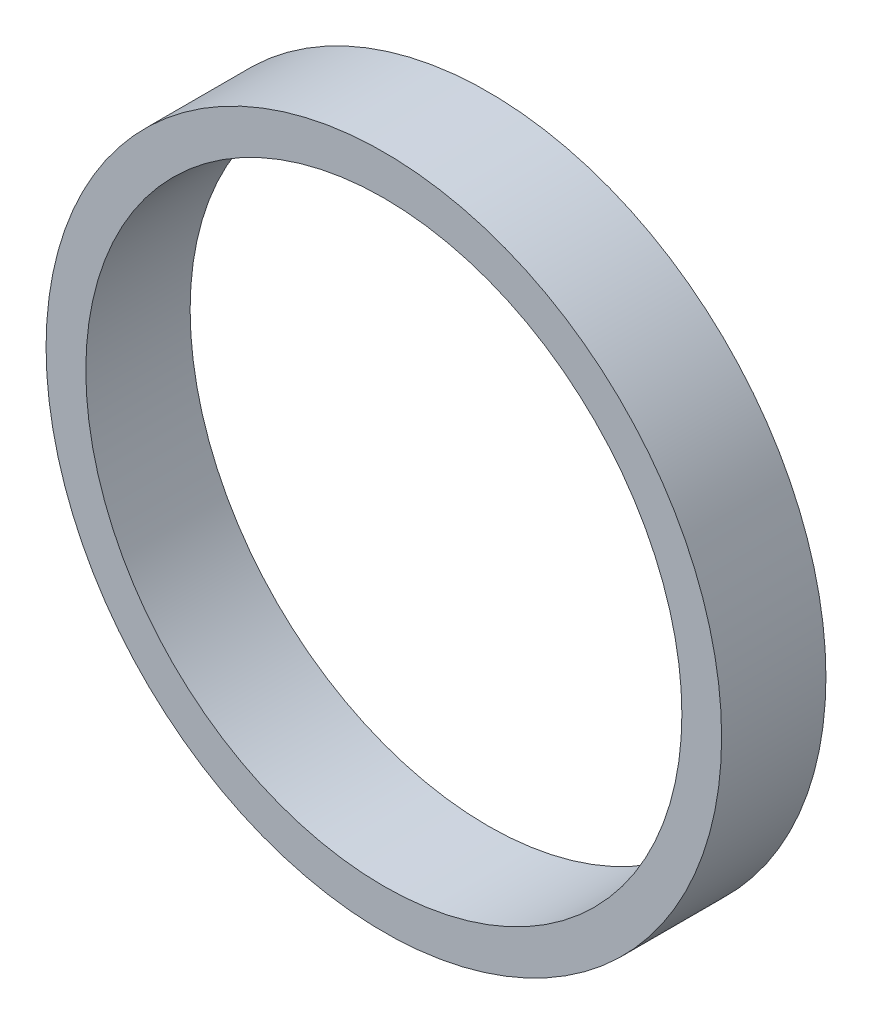
ISO-10303-21;
HEADER;
FILE_DESCRIPTION(('STEP AP214'),'2;1');
FILE_NAME('part.step','',(''),(''),'','','');
FILE_SCHEMA(('AUTOMOTIVE_DESIGN { 1 0 10303 214 1 1 1 1 }'));
ENDSEC;
DATA;
#1=APPLICATION_CONTEXT('core data for automotive mechanical design processes');
#2=APPLICATION_PROTOCOL_DEFINITION('international standard','automotive_design',2000,#1);
#3=PRODUCT_CONTEXT('',#1,'mechanical');
#4=PRODUCT('Part','Part','',(#3));
#5=PRODUCT_RELATED_PRODUCT_CATEGORY('part','',(#4));
#6=PRODUCT_DEFINITION_FORMATION('','',#4);
#7=PRODUCT_DEFINITION_CONTEXT('part definition',#1,'design');
#8=PRODUCT_DEFINITION('design','',#6,#7);
#9=PRODUCT_DEFINITION_SHAPE('','',#8);
#10=(LENGTH_UNIT() NAMED_UNIT(*) SI_UNIT(.MILLI.,.METRE.));
#11=(NAMED_UNIT(*) PLANE_ANGLE_UNIT() SI_UNIT($,.RADIAN.));
#12=(NAMED_UNIT(*) SI_UNIT($,.STERADIAN.) SOLID_ANGLE_UNIT());
#13=UNCERTAINTY_MEASURE_WITH_UNIT(LENGTH_MEASURE(1.E-05),#10,'distance_accuracy_value','');
#14=(GEOMETRIC_REPRESENTATION_CONTEXT(3) GLOBAL_UNCERTAINTY_ASSIGNED_CONTEXT((#13)) GLOBAL_UNIT_ASSIGNED_CONTEXT((#10,
#11,#12)) REPRESENTATION_CONTEXT('',''));
#15=CARTESIAN_POINT('',(0.,0.,0.));
#16=DIRECTION('',(0.,0.,1.));
#17=DIRECTION('',(1.,0.,0.));
#18=AXIS2_PLACEMENT_3D('',#15,#16,#17);
#19=CARTESIAN_POINT('',(0.,0.,10.5));
#20=DIRECTION('',(0.,0.,1.));
#21=DIRECTION('',(1.,0.,0.));
#22=AXIS2_PLACEMENT_3D('',#19,#20,#21);
#23=PLANE('',#22);
#24=CARTESIAN_POINT('',(0.,0.,10.5));
#25=DIRECTION('',(0.,0.,1.));
#26=DIRECTION('',(1.,0.,0.));
#27=AXIS2_PLACEMENT_3D('',#24,#25,#26);
#28=CIRCLE('',#27,34.);
#29=CARTESIAN_POINT('',(-34.,0.,10.5));
#30=VERTEX_POINT('',#29);
#31=EDGE_CURVE('E10',#30,#30,#28,.T.);
#32=ORIENTED_EDGE('',*,*,#31,.T.);
#33=EDGE_LOOP('',(#32));
#34=FACE_BOUND('',#33,.T.);
#35=CARTESIAN_POINT('',(0.,0.,10.5));
#36=DIRECTION('',(0.,0.,1.));
#37=DIRECTION('',(1.,0.,0.));
#38=AXIS2_PLACEMENT_3D('',#35,#36,#37);
#39=CIRCLE('',#38,30.);
#40=CARTESIAN_POINT('',(-30.,0.,10.5));
#41=VERTEX_POINT('',#40);
#42=EDGE_CURVE('E41',#41,#41,#39,.T.);
#43=ORIENTED_EDGE('',*,*,#42,.F.);
#44=EDGE_LOOP('',(#43));
#45=FACE_BOUND('',#44,.T.);
#46=ADVANCED_FACE('F30',(#34,#45),#23,.T.);
#47=CARTESIAN_POINT('',(0.,0.,0.));
#48=DIRECTION('',(0.,0.,1.));
#49=DIRECTION('',(1.,0.,0.));
#50=AXIS2_PLACEMENT_3D('',#47,#48,#49);
#51=PLANE('',#50);
#52=CARTESIAN_POINT('',(0.,0.,0.));
#53=DIRECTION('',(0.,0.,1.));
#54=DIRECTION('',(1.,0.,0.));
#55=AXIS2_PLACEMENT_3D('',#52,#53,#54);
#56=CIRCLE('',#55,34.);
#57=CARTESIAN_POINT('',(-34.,0.,0.));
#58=VERTEX_POINT('',#57);
#59=EDGE_CURVE('E34',#58,#58,#56,.T.);
#60=ORIENTED_EDGE('',*,*,#59,.F.);
#61=EDGE_LOOP('',(#60));
#62=FACE_BOUND('',#61,.T.);
#63=CARTESIAN_POINT('',(0.,0.,0.));
#64=DIRECTION('',(0.,0.,1.));
#65=DIRECTION('',(1.,0.,0.));
#66=AXIS2_PLACEMENT_3D('',#63,#64,#65);
#67=CIRCLE('',#66,30.);
#68=CARTESIAN_POINT('',(-30.,0.,0.));
#69=VERTEX_POINT('',#68);
#70=EDGE_CURVE('E43',#69,#69,#67,.T.);
#71=ORIENTED_EDGE('',*,*,#70,.T.);
#72=EDGE_LOOP('',(#71));
#73=FACE_BOUND('',#72,.T.);
#74=ADVANCED_FACE('F53',(#62,#73),#51,.F.);
#75=CARTESIAN_POINT('',(0.,0.,10.5));
#76=DIRECTION('',(0.,0.,-1.));
#77=DIRECTION('',(-1.,0.,0.));
#78=AXIS2_PLACEMENT_3D('',#75,#76,#77);
#79=CYLINDRICAL_SURFACE('',#78,34.);
#80=CARTESIAN_POINT('',(-34.,0.,10.5));
#81=CARTESIAN_POINT('',(-34.,0.,10.390625));
#82=CARTESIAN_POINT('',(-34.,0.,10.28125));
#83=CARTESIAN_POINT('',(-34.,0.,10.0625));
#84=CARTESIAN_POINT('',(-34.,0.,9.953125));
#85=CARTESIAN_POINT('',(-34.,0.,9.734375));
#86=CARTESIAN_POINT('',(-34.,0.,9.625));
#87=CARTESIAN_POINT('',(-34.,0.,9.40625));
#88=CARTESIAN_POINT('',(-34.,0.,9.296875));
#89=CARTESIAN_POINT('',(-34.,0.,9.078125));
#90=CARTESIAN_POINT('',(-34.,0.,8.96875));
#91=CARTESIAN_POINT('',(-34.,0.,8.75));
#92=CARTESIAN_POINT('',(-34.,0.,8.640625));
#93=CARTESIAN_POINT('',(-34.,0.,8.421875));
#94=CARTESIAN_POINT('',(-34.,0.,8.3125));
#95=CARTESIAN_POINT('',(-34.,0.,8.09375));
#96=CARTESIAN_POINT('',(-34.,0.,7.984375));
#97=CARTESIAN_POINT('',(-34.,0.,7.765625));
#98=CARTESIAN_POINT('',(-34.,0.,7.65625));
#99=CARTESIAN_POINT('',(-34.,0.,7.4375));
#100=CARTESIAN_POINT('',(-34.,0.,7.328125));
#101=CARTESIAN_POINT('',(-34.,0.,7.109375));
#102=CARTESIAN_POINT('',(-34.,0.,7.));
#103=CARTESIAN_POINT('',(-34.,0.,6.78125));
#104=CARTESIAN_POINT('',(-34.,0.,6.671875));
#105=CARTESIAN_POINT('',(-34.,0.,6.453125));
#106=CARTESIAN_POINT('',(-34.,0.,6.34375));
#107=CARTESIAN_POINT('',(-34.,0.,6.125));
#108=CARTESIAN_POINT('',(-34.,0.,6.015625));
#109=CARTESIAN_POINT('',(-34.,0.,5.796875));
#110=CARTESIAN_POINT('',(-34.,0.,5.6875));
#111=CARTESIAN_POINT('',(-34.,0.,5.46875));
#112=CARTESIAN_POINT('',(-34.,0.,5.359375));
#113=CARTESIAN_POINT('',(-34.,0.,5.140625));
#114=CARTESIAN_POINT('',(-34.,0.,5.03125));
#115=CARTESIAN_POINT('',(-34.,0.,4.8125));
#116=CARTESIAN_POINT('',(-34.,0.,4.703125));
#117=CARTESIAN_POINT('',(-34.,0.,4.484375));
#118=CARTESIAN_POINT('',(-34.,0.,4.375));
#119=CARTESIAN_POINT('',(-34.,0.,4.15625));
#120=CARTESIAN_POINT('',(-34.,0.,4.046875));
#121=CARTESIAN_POINT('',(-34.,0.,3.828125));
#122=CARTESIAN_POINT('',(-34.,0.,3.71875));
#123=CARTESIAN_POINT('',(-34.,0.,3.5));
#124=CARTESIAN_POINT('',(-34.,0.,3.390625));
#125=CARTESIAN_POINT('',(-34.,0.,3.171875));
#126=CARTESIAN_POINT('',(-34.,0.,3.0625));
#127=CARTESIAN_POINT('',(-34.,0.,2.84375));
#128=CARTESIAN_POINT('',(-34.,0.,2.734375));
#129=CARTESIAN_POINT('',(-34.,0.,2.515625));
#130=CARTESIAN_POINT('',(-34.,0.,2.40625));
#131=CARTESIAN_POINT('',(-34.,0.,2.1875));
#132=CARTESIAN_POINT('',(-34.,0.,2.078125));
#133=CARTESIAN_POINT('',(-34.,0.,1.859375));
#134=CARTESIAN_POINT('',(-34.,0.,1.75));
#135=CARTESIAN_POINT('',(-34.,0.,1.53125));
#136=CARTESIAN_POINT('',(-34.,0.,1.421875));
#137=CARTESIAN_POINT('',(-34.,0.,1.203125));
#138=CARTESIAN_POINT('',(-34.,0.,1.09375));
#139=CARTESIAN_POINT('',(-34.,0.,0.875000000000001));
#140=CARTESIAN_POINT('',(-34.,0.,0.765625000000001));
#141=CARTESIAN_POINT('',(-34.,0.,0.546875));
#142=CARTESIAN_POINT('',(-34.,0.,0.4375));
#143=CARTESIAN_POINT('',(-34.,0.,0.21875));
#144=CARTESIAN_POINT('',(-34.,0.,0.109375));
#145=CARTESIAN_POINT('',(-34.,0.,0.));
#146=B_SPLINE_CURVE_WITH_KNOTS('',3,(#80,#81,#82,#83,#84,#85,#86,#87,#88,#89,#90,#91,#92,#93,
#94,#95,#96,#97,#98,#99,#100,#101,#102,#103,#104,#105,#106,#107,#108,#109,#110,#111,#112,#113,
#114,#115,#116,#117,#118,#119,#120,#121,#122,#123,#124,#125,#126,#127,#128,#129,#130,#131,#132,
#133,#134,#135,#136,#137,#138,#139,#140,#141,#142,#143,#144,#145),.UNSPECIFIED.,.F.,.F.,(4,2,2,
2,2,2,2,2,2,2,2,2,2,2,2,2,2,2,2,2,2,2,2,2,2,2,2,2,2,2,2,2,4),(0.,0.328124999999999,
0.656249999999999,0.984374999999999,1.3125,1.640625,1.96875,2.296875,2.625,2.953125,3.28125,
3.609375,3.9375,4.265625,4.59375,4.921875,5.25,5.578125,5.90625,6.234375,6.5625,6.890625,
7.21875,7.546875,7.875,8.203125,8.53125,8.859375,9.1875,9.515625,9.84375,10.171875,10.5),.UNSPECIFIED.);
#147=EDGE_CURVE('BSEAM32',#30,#58,#146,.T.);
#148=ORIENTED_EDGE('',*,*,#31,.F.);
#149=ORIENTED_EDGE('',*,*,#59,.T.);
#150=ORIENTED_EDGE('',*,*,#147,.T.);
#151=ORIENTED_EDGE('',*,*,#147,.F.);
#152=EDGE_LOOP('',(#148,#150,#149,#151));
#153=FACE_BOUND('',#152,.T.);
#154=ADVANCED_FACE('F32',(#153),#79,.T.);
#155=CARTESIAN_POINT('',(0.,0.,10.5));
#156=DIRECTION('',(0.,0.,-1.));
#157=DIRECTION('',(-1.,0.,0.));
#158=AXIS2_PLACEMENT_3D('',#155,#156,#157);
#159=CYLINDRICAL_SURFACE('',#158,30.);
#160=CARTESIAN_POINT('',(-30.,0.,10.5));
#161=CARTESIAN_POINT('',(-30.,0.,10.390625));
#162=CARTESIAN_POINT('',(-30.,0.,10.28125));
#163=CARTESIAN_POINT('',(-30.,0.,10.0625));
#164=CARTESIAN_POINT('',(-30.,0.,9.953125));
#165=CARTESIAN_POINT('',(-30.,0.,9.734375));
#166=CARTESIAN_POINT('',(-30.,0.,9.625));
#167=CARTESIAN_POINT('',(-30.,0.,9.40625));
#168=CARTESIAN_POINT('',(-30.,0.,9.296875));
#169=CARTESIAN_POINT('',(-30.,0.,9.078125));
#170=CARTESIAN_POINT('',(-30.,0.,8.96875));
#171=CARTESIAN_POINT('',(-30.,0.,8.75));
#172=CARTESIAN_POINT('',(-30.,0.,8.640625));
#173=CARTESIAN_POINT('',(-30.,0.,8.421875));
#174=CARTESIAN_POINT('',(-30.,0.,8.3125));
#175=CARTESIAN_POINT('',(-30.,0.,8.09375));
#176=CARTESIAN_POINT('',(-30.,0.,7.984375));
#177=CARTESIAN_POINT('',(-30.,0.,7.765625));
#178=CARTESIAN_POINT('',(-30.,0.,7.65625));
#179=CARTESIAN_POINT('',(-30.,0.,7.4375));
#180=CARTESIAN_POINT('',(-30.,0.,7.328125));
#181=CARTESIAN_POINT('',(-30.,0.,7.109375));
#182=CARTESIAN_POINT('',(-30.,0.,7.));
#183=CARTESIAN_POINT('',(-30.,0.,6.78125));
#184=CARTESIAN_POINT('',(-30.,0.,6.671875));
#185=CARTESIAN_POINT('',(-30.,0.,6.453125));
#186=CARTESIAN_POINT('',(-30.,0.,6.34375));
#187=CARTESIAN_POINT('',(-30.,0.,6.125));
#188=CARTESIAN_POINT('',(-30.,0.,6.015625));
#189=CARTESIAN_POINT('',(-30.,0.,5.796875));
#190=CARTESIAN_POINT('',(-30.,0.,5.6875));
#191=CARTESIAN_POINT('',(-30.,0.,5.46875));
#192=CARTESIAN_POINT('',(-30.,0.,5.359375));
#193=CARTESIAN_POINT('',(-30.,0.,5.140625));
#194=CARTESIAN_POINT('',(-30.,0.,5.03125));
#195=CARTESIAN_POINT('',(-30.,0.,4.8125));
#196=CARTESIAN_POINT('',(-30.,0.,4.703125));
#197=CARTESIAN_POINT('',(-30.,0.,4.484375));
#198=CARTESIAN_POINT('',(-30.,0.,4.375));
#199=CARTESIAN_POINT('',(-30.,0.,4.15625));
#200=CARTESIAN_POINT('',(-30.,0.,4.046875));
#201=CARTESIAN_POINT('',(-30.,0.,3.828125));
#202=CARTESIAN_POINT('',(-30.,0.,3.71875));
#203=CARTESIAN_POINT('',(-30.,0.,3.5));
#204=CARTESIAN_POINT('',(-30.,0.,3.390625));
#205=CARTESIAN_POINT('',(-30.,0.,3.171875));
#206=CARTESIAN_POINT('',(-30.,0.,3.0625));
#207=CARTESIAN_POINT('',(-30.,0.,2.84375));
#208=CARTESIAN_POINT('',(-30.,0.,2.734375));
#209=CARTESIAN_POINT('',(-30.,0.,2.515625));
#210=CARTESIAN_POINT('',(-30.,0.,2.40625));
#211=CARTESIAN_POINT('',(-30.,0.,2.1875));
#212=CARTESIAN_POINT('',(-30.,0.,2.078125));
#213=CARTESIAN_POINT('',(-30.,0.,1.859375));
#214=CARTESIAN_POINT('',(-30.,0.,1.75));
#215=CARTESIAN_POINT('',(-30.,0.,1.53125));
#216=CARTESIAN_POINT('',(-30.,0.,1.421875));
#217=CARTESIAN_POINT('',(-30.,0.,1.203125));
#218=CARTESIAN_POINT('',(-30.,0.,1.09375));
#219=CARTESIAN_POINT('',(-30.,0.,0.875000000000001));
#220=CARTESIAN_POINT('',(-30.,0.,0.765625000000001));
#221=CARTESIAN_POINT('',(-30.,0.,0.546875));
#222=CARTESIAN_POINT('',(-30.,0.,0.4375));
#223=CARTESIAN_POINT('',(-30.,0.,0.21875));
#224=CARTESIAN_POINT('',(-30.,0.,0.109375));
#225=CARTESIAN_POINT('',(-30.,0.,0.));
#226=B_SPLINE_CURVE_WITH_KNOTS('',3,(#160,#161,#162,#163,#164,#165,#166,#167,#168,#169,#170,
#171,#172,#173,#174,#175,#176,#177,#178,#179,#180,#181,#182,#183,#184,#185,#186,#187,#188,#189,
#190,#191,#192,#193,#194,#195,#196,#197,#198,#199,#200,#201,#202,#203,#204,#205,#206,#207,#208,
#209,#210,#211,#212,#213,#214,#215,#216,#217,#218,#219,#220,#221,#222,#223,#224,#225),
.UNSPECIFIED.,.F.,.F.,(4,2,2,2,2,2,2,2,2,2,2,2,2,2,2,2,2,2,2,2,2,2,2,2,2,2,2,2,2,2,2,2,4),(0.,
0.328125,0.656250000000001,0.984375000000001,1.3125,1.640625,1.96875,2.296875,2.625,2.953125,
3.28125,3.609375,3.9375,4.265625,4.59375,4.921875,5.25,5.578125,5.90625,6.234375,6.5625,
6.890625,7.21875,7.546875,7.875,8.203125,8.53125,8.859375,9.1875,9.515625,9.84375,10.171875,
10.5),.UNSPECIFIED.);
#227=EDGE_CURVE('BSEAM49',#41,#69,#226,.T.);
#228=ORIENTED_EDGE('',*,*,#42,.T.);
#229=ORIENTED_EDGE('',*,*,#70,.F.);
#230=ORIENTED_EDGE('',*,*,#227,.T.);
#231=ORIENTED_EDGE('',*,*,#227,.F.);
#232=EDGE_LOOP('',(#228,#230,#229,#231));
#233=FACE_BOUND('',#232,.T.);
#234=ADVANCED_FACE('F49',(#233),#159,.F.);
#235=CLOSED_SHELL('',(#46,#74,#154,#234));
#236=MANIFOLD_SOLID_BREP('B2',#235);
#237=ADVANCED_BREP_SHAPE_REPRESENTATION('',(#18,#236),#14);
#238=SHAPE_DEFINITION_REPRESENTATION(#9,#237);
ENDSEC;
END-ISO-10303-21;
